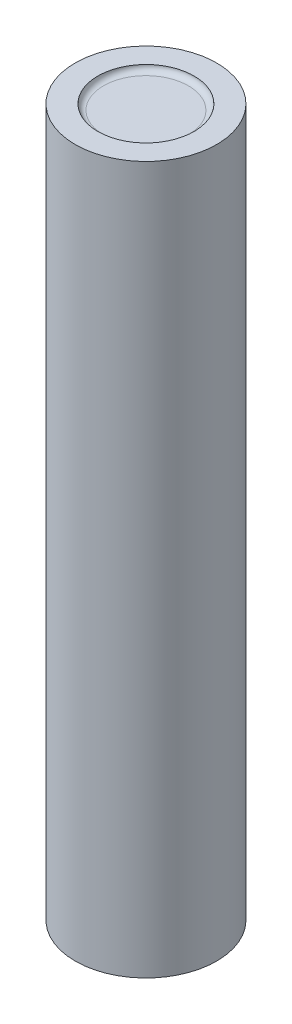
ISO-10303-21;
HEADER;
FILE_DESCRIPTION(('STEP AP214'),'2;1');
FILE_NAME('part.step','',(''),(''),'','','');
FILE_SCHEMA(('AUTOMOTIVE_DESIGN { 1 0 10303 214 1 1 1 1 }'));
ENDSEC;
DATA;
#1=APPLICATION_CONTEXT('core data for automotive mechanical design processes');
#2=APPLICATION_PROTOCOL_DEFINITION('international standard','automotive_design',2000,#1);
#3=PRODUCT_CONTEXT('',#1,'mechanical');
#4=PRODUCT('Part','Part','',(#3));
#5=PRODUCT_RELATED_PRODUCT_CATEGORY('part','',(#4));
#6=PRODUCT_DEFINITION_FORMATION('','',#4);
#7=PRODUCT_DEFINITION_CONTEXT('part definition',#1,'design');
#8=PRODUCT_DEFINITION('design','',#6,#7);
#9=PRODUCT_DEFINITION_SHAPE('','',#8);
#10=(LENGTH_UNIT() NAMED_UNIT(*) SI_UNIT(.MILLI.,.METRE.));
#11=(NAMED_UNIT(*) PLANE_ANGLE_UNIT() SI_UNIT($,.RADIAN.));
#12=(NAMED_UNIT(*) SI_UNIT($,.STERADIAN.) SOLID_ANGLE_UNIT());
#13=UNCERTAINTY_MEASURE_WITH_UNIT(LENGTH_MEASURE(1.E-05),#10,'distance_accuracy_value','');
#14=(GEOMETRIC_REPRESENTATION_CONTEXT(3) GLOBAL_UNCERTAINTY_ASSIGNED_CONTEXT((#13)) GLOBAL_UNIT_ASSIGNED_CONTEXT((#10,
#11,#12)) REPRESENTATION_CONTEXT('',''));
#15=CARTESIAN_POINT('',(0.,0.,0.));
#16=DIRECTION('',(0.,0.,1.));
#17=DIRECTION('',(1.,0.,0.));
#18=AXIS2_PLACEMENT_3D('',#15,#16,#17);
#19=CARTESIAN_POINT('',(0.,125.,0.));
#20=DIRECTION('',(0.,-1.,0.));
#21=DIRECTION('',(0.,0.,-1.));
#22=AXIS2_PLACEMENT_3D('',#19,#20,#21);
#23=CYLINDRICAL_SURFACE('',#22,12.5);
#24=CARTESIAN_POINT('',(0.,125.,0.));
#25=DIRECTION('',(0.,1.,0.));
#26=DIRECTION('',(0.,0.,1.));
#27=AXIS2_PLACEMENT_3D('',#24,#25,#26);
#28=CIRCLE('',#27,12.5);
#29=CARTESIAN_POINT('',(0.,125.,12.5));
#30=VERTEX_POINT('',#29);
#31=EDGE_CURVE('E53',#30,#30,#28,.T.);
#32=ORIENTED_EDGE('',*,*,#31,.F.);
#33=EDGE_LOOP('',(#32));
#34=FACE_BOUND('',#33,.T.);
#35=CARTESIAN_POINT('',(0.,0.,0.));
#36=DIRECTION('',(0.,1.,0.));
#37=DIRECTION('',(0.,0.,1.));
#38=AXIS2_PLACEMENT_3D('',#35,#36,#37);
#39=CIRCLE('',#38,12.5);
#40=CARTESIAN_POINT('',(0.,0.,12.5));
#41=VERTEX_POINT('',#40);
#42=EDGE_CURVE('E56',#41,#41,#39,.T.);
#43=ORIENTED_EDGE('',*,*,#42,.T.);
#44=EDGE_LOOP('',(#43));
#45=FACE_BOUND('',#44,.T.);
#46=ADVANCED_FACE('F38',(#34,#45),#23,.T.);
#47=CARTESIAN_POINT('',(0.,125.,0.));
#48=DIRECTION('',(0.,1.,0.));
#49=DIRECTION('',(0.,0.,1.));
#50=AXIS2_PLACEMENT_3D('',#47,#48,#49);
#51=PLANE('',#50);
#52=CARTESIAN_POINT('',(0.,125.,0.));
#53=DIRECTION('',(0.,1.,0.));
#54=DIRECTION('',(0.,0.,1.));
#55=AXIS2_PLACEMENT_3D('',#52,#53,#54);
#56=CIRCLE('',#55,8.5);
#57=CARTESIAN_POINT('',(0.,125.,8.5));
#58=VERTEX_POINT('',#57);
#59=EDGE_CURVE('E64',#58,#58,#56,.T.);
#60=ORIENTED_EDGE('',*,*,#59,.F.);
#61=EDGE_LOOP('',(#60));
#62=FACE_BOUND('',#61,.T.);
#63=ORIENTED_EDGE('',*,*,#31,.T.);
#64=EDGE_LOOP('',(#63));
#65=FACE_BOUND('',#64,.T.);
#66=ADVANCED_FACE('F70',(#62,#65),#51,.T.);
#67=CARTESIAN_POINT('',(0.,0.,0.));
#68=DIRECTION('',(0.,1.,0.));
#69=DIRECTION('',(0.,0.,1.));
#70=AXIS2_PLACEMENT_3D('',#67,#68,#69);
#71=PLANE('',#70);
#72=CARTESIAN_POINT('',(0.,0.,0.));
#73=DIRECTION('',(0.,1.,0.));
#74=DIRECTION('',(0.,0.,1.));
#75=AXIS2_PLACEMENT_3D('',#72,#73,#74);
#76=CIRCLE('',#75,5.);
#77=CARTESIAN_POINT('',(0.,0.,5.));
#78=VERTEX_POINT('',#77);
#79=EDGE_CURVE('E59',#78,#78,#76,.T.);
#80=ORIENTED_EDGE('',*,*,#79,.T.);
#81=EDGE_LOOP('',(#80));
#82=FACE_BOUND('',#81,.T.);
#83=ORIENTED_EDGE('',*,*,#42,.F.);
#84=EDGE_LOOP('',(#83));
#85=FACE_BOUND('',#84,.T.);
#86=ADVANCED_FACE('F73',(#82,#85),#71,.F.);
#87=CARTESIAN_POINT('',(0.,-5.,0.));
#88=DIRECTION('',(0.,1.,0.));
#89=DIRECTION('',(0.,0.,1.));
#90=AXIS2_PLACEMENT_3D('',#87,#88,#89);
#91=CYLINDRICAL_SURFACE('',#90,5.);
#92=CARTESIAN_POINT('',(0.,-4.,0.));
#93=DIRECTION('',(0.,1.,0.));
#94=DIRECTION('',(0.,0.,1.));
#95=AXIS2_PLACEMENT_3D('',#92,#93,#94);
#96=CIRCLE('',#95,5.);
#97=CARTESIAN_POINT('',(0.,-4.,5.));
#98=VERTEX_POINT('',#97);
#99=EDGE_CURVE('E49',#98,#98,#96,.T.);
#100=ORIENTED_EDGE('',*,*,#99,.T.);
#101=EDGE_LOOP('',(#100));
#102=FACE_BOUND('',#101,.T.);
#103=ORIENTED_EDGE('',*,*,#79,.F.);
#104=EDGE_LOOP('',(#103));
#105=FACE_BOUND('',#104,.T.);
#106=ADVANCED_FACE('F83',(#102,#105),#91,.T.);
#107=CARTESIAN_POINT('',(0.,-5.,0.));
#108=DIRECTION('',(0.,1.,0.));
#109=DIRECTION('',(0.,0.,1.));
#110=AXIS2_PLACEMENT_3D('',#107,#108,#109);
#111=PLANE('',#110);
#112=CARTESIAN_POINT('',(0.,-5.,0.));
#113=DIRECTION('',(0.,1.,0.));
#114=DIRECTION('',(0.,0.,1.));
#115=AXIS2_PLACEMENT_3D('',#112,#113,#114);
#116=CIRCLE('',#115,4.);
#117=CARTESIAN_POINT('',(0.,-5.,4.));
#118=VERTEX_POINT('',#117);
#119=EDGE_CURVE('E45',#118,#118,#116,.F.);
#120=ORIENTED_EDGE('',*,*,#119,.T.);
#121=EDGE_LOOP('',(#120));
#122=FACE_BOUND('',#121,.T.);
#123=ADVANCED_FACE('F89',(#122),#111,.F.);
#124=CARTESIAN_POINT('',(0.,-4.,0.));
#125=DIRECTION('',(0.,1.,0.));
#126=DIRECTION('',(0.,0.,1.));
#127=AXIS2_PLACEMENT_3D('',#124,#125,#126);
#128=TOROIDAL_SURFACE('',#127,4.,1.);
#129=ORIENTED_EDGE('',*,*,#119,.F.);
#130=EDGE_LOOP('',(#129));
#131=FACE_BOUND('',#130,.T.);
#132=ORIENTED_EDGE('',*,*,#99,.F.);
#133=EDGE_LOOP('',(#132));
#134=FACE_BOUND('',#133,.T.);
#135=ADVANCED_FACE('F92',(#131,#134),#128,.T.);
#136=CARTESIAN_POINT('',(0.,124.,0.));
#137=DIRECTION('',(0.,1.,0.));
#138=DIRECTION('',(0.,0.,1.));
#139=AXIS2_PLACEMENT_3D('',#136,#137,#138);
#140=PLANE('',#139);
#141=CARTESIAN_POINT('',(0.,124.,0.));
#142=DIRECTION('',(0.,1.,0.));
#143=DIRECTION('',(0.,0.,1.));
#144=AXIS2_PLACEMENT_3D('',#141,#142,#143);
#145=CIRCLE('',#144,7.5);
#146=CARTESIAN_POINT('',(0.,124.,7.5));
#147=VERTEX_POINT('',#146);
#148=EDGE_CURVE('E10',#147,#147,#145,.T.);
#149=ORIENTED_EDGE('',*,*,#148,.T.);
#150=EDGE_LOOP('',(#149));
#151=FACE_BOUND('',#150,.T.);
#152=ADVANCED_FACE('F94',(#151),#140,.T.);
#153=CARTESIAN_POINT('',(0.,125.,0.));
#154=DIRECTION('',(0.,1.,0.));
#155=DIRECTION('',(0.,0.,1.));
#156=AXIS2_PLACEMENT_3D('',#153,#154,#155);
#157=TOROIDAL_SURFACE('',#156,7.5,1.);
#158=ORIENTED_EDGE('',*,*,#59,.T.);
#159=EDGE_LOOP('',(#158));
#160=FACE_BOUND('',#159,.T.);
#161=ORIENTED_EDGE('',*,*,#148,.F.);
#162=EDGE_LOOP('',(#161));
#163=FACE_BOUND('',#162,.T.);
#164=ADVANCED_FACE('F40',(#160,#163),#157,.F.);
#165=CLOSED_SHELL('',(#46,#66,#86,#106,#123,#135,#152,#164));
#166=MANIFOLD_SOLID_BREP('B2',#165);
#167=ADVANCED_BREP_SHAPE_REPRESENTATION('',(#18,#166),#14);
#168=SHAPE_DEFINITION_REPRESENTATION(#9,#167);
ENDSEC;
END-ISO-10303-21;
